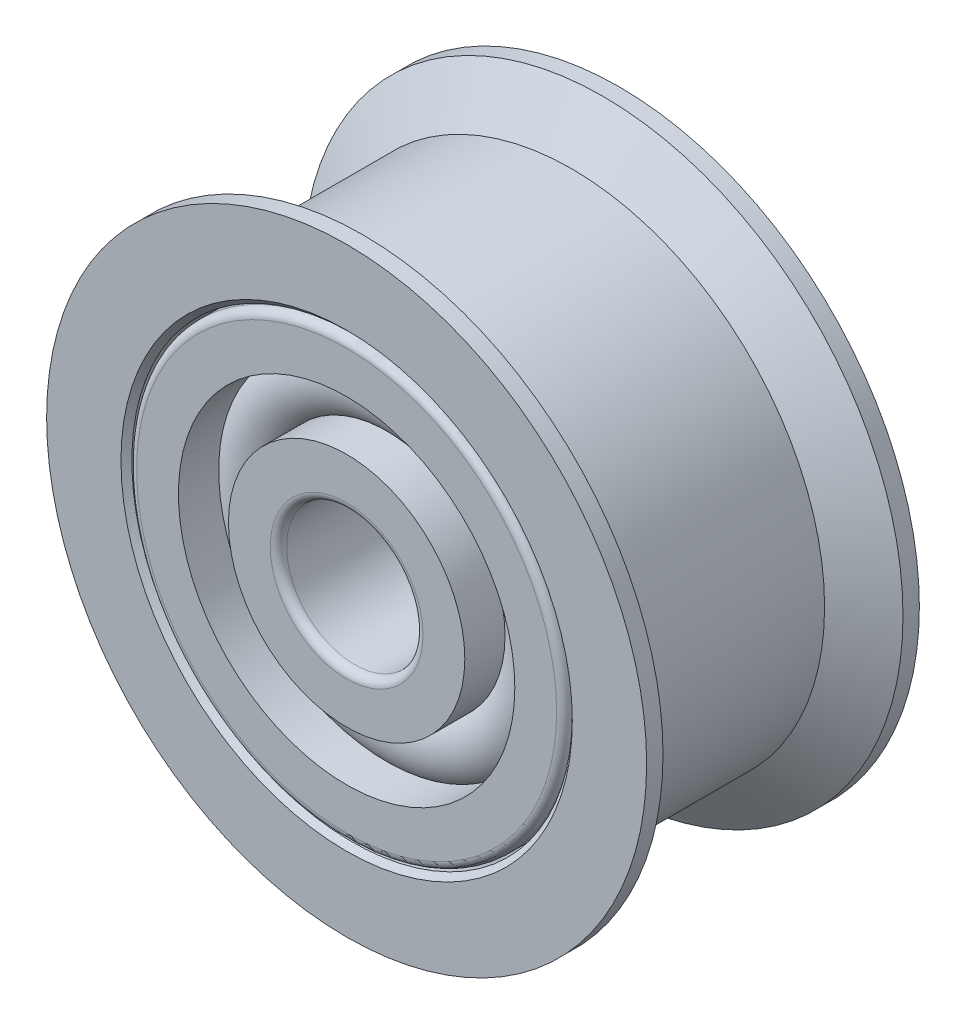
ISO-10303-21;
HEADER;
FILE_DESCRIPTION(('STEP AP214'),'2;1');
FILE_NAME('part.step','',(''),(''),'','','');
FILE_SCHEMA(('AUTOMOTIVE_DESIGN { 1 0 10303 214 1 1 1 1 }'));
ENDSEC;
DATA;
#1=APPLICATION_CONTEXT('core data for automotive mechanical design processes');
#2=APPLICATION_PROTOCOL_DEFINITION('international standard','automotive_design',2000,#1);
#3=PRODUCT_CONTEXT('',#1,'mechanical');
#4=PRODUCT('Part','Part','',(#3));
#5=PRODUCT_RELATED_PRODUCT_CATEGORY('part','',(#4));
#6=PRODUCT_DEFINITION_FORMATION('','',#4);
#7=PRODUCT_DEFINITION_CONTEXT('part definition',#1,'design');
#8=PRODUCT_DEFINITION('design','',#6,#7);
#9=PRODUCT_DEFINITION_SHAPE('','',#8);
#10=(LENGTH_UNIT() NAMED_UNIT(*) SI_UNIT(.MILLI.,.METRE.));
#11=(NAMED_UNIT(*) PLANE_ANGLE_UNIT() SI_UNIT($,.RADIAN.));
#12=(NAMED_UNIT(*) SI_UNIT($,.STERADIAN.) SOLID_ANGLE_UNIT());
#13=UNCERTAINTY_MEASURE_WITH_UNIT(LENGTH_MEASURE(1.E-05),#10,'distance_accuracy_value','');
#14=(GEOMETRIC_REPRESENTATION_CONTEXT(3) GLOBAL_UNCERTAINTY_ASSIGNED_CONTEXT((#13)) GLOBAL_UNIT_ASSIGNED_CONTEXT((#10,
#11,#12)) REPRESENTATION_CONTEXT('',''));
#15=CARTESIAN_POINT('',(0.,0.,0.));
#16=DIRECTION('',(0.,0.,1.));
#17=DIRECTION('',(1.,0.,0.));
#18=AXIS2_PLACEMENT_3D('',#15,#16,#17);
#19=CARTESIAN_POINT('',(0.,8.00000000000001,0.));
#20=DIRECTION('',(0.,0.,1.));
#21=DIRECTION('',(-1.,0.,0.));
#22=AXIS2_PLACEMENT_3D('',#19,#20,#21);
#23=PLANE('',#22);
#24=CARTESIAN_POINT('',(0.,0.,0.));
#25=DIRECTION('',(0.,0.,-1.));
#26=DIRECTION('',(-1.,0.,0.));
#27=AXIS2_PLACEMENT_3D('',#24,#25,#26);
#28=CIRCLE('',#27,7.70000000000001);
#29=CARTESIAN_POINT('',(-7.70000000000001,0.,0.));
#30=VERTEX_POINT('',#29);
#31=EDGE_CURVE('E56',#30,#30,#28,.F.);
#32=ORIENTED_EDGE('',*,*,#31,.F.);
#33=EDGE_LOOP('',(#32));
#34=FACE_BOUND('',#33,.T.);
#35=CARTESIAN_POINT('',(0.,0.,0.));
#36=DIRECTION('',(0.,0.,1.));
#37=DIRECTION('',(1.,0.,0.));
#38=AXIS2_PLACEMENT_3D('',#35,#36,#37);
#39=CIRCLE('',#38,6.16666666666667);
#40=CARTESIAN_POINT('',(6.16666666666667,0.,0.));
#41=VERTEX_POINT('',#40);
#42=EDGE_CURVE('E84',#41,#41,#39,.T.);
#43=ORIENTED_EDGE('',*,*,#42,.T.);
#44=EDGE_LOOP('',(#43));
#45=FACE_BOUND('',#44,.T.);
#46=ADVANCED_FACE('F49',(#34,#45),#23,.F.);
#47=CARTESIAN_POINT('',(0.,0.,-47.8916163431199));
#48=DIRECTION('',(0.,0.,-1.));
#49=DIRECTION('',(1.,0.,0.));
#50=AXIS2_PLACEMENT_3D('',#47,#48,#49);
#51=CYLINDRICAL_SURFACE('',#50,6.16666666666667);
#52=CARTESIAN_POINT('',(0.,0.,1.47513551031261));
#53=DIRECTION('',(0.,0.,-1.));
#54=DIRECTION('',(-1.,0.,0.));
#55=AXIS2_PLACEMENT_3D('',#52,#53,#54);
#56=CIRCLE('',#55,6.16666666666667);
#57=CARTESIAN_POINT('',(-6.16666666666667,0.,1.47513551031261));
#58=VERTEX_POINT('',#57);
#59=EDGE_CURVE('E102',#58,#58,#56,.T.);
#60=ORIENTED_EDGE('',*,*,#59,.F.);
#61=EDGE_LOOP('',(#60));
#62=FACE_BOUND('',#61,.T.);
#63=ORIENTED_EDGE('',*,*,#42,.F.);
#64=EDGE_LOOP('',(#63));
#65=FACE_BOUND('',#64,.T.);
#66=ADVANCED_FACE('F108',(#62,#65),#51,.F.);
#67=CARTESIAN_POINT('',(0.,0.,-47.8916163431199));
#68=DIRECTION('',(0.,0.,-1.));
#69=DIRECTION('',(1.,0.,0.));
#70=AXIS2_PLACEMENT_3D('',#67,#68,#69);
#71=CYLINDRICAL_SURFACE('',#70,6.16666666666667);
#72=CARTESIAN_POINT('',(0.,0.,3.52486448968744));
#73=DIRECTION('',(0.,0.,1.));
#74=DIRECTION('',(1.,0.,0.));
#75=AXIS2_PLACEMENT_3D('',#72,#73,#74);
#76=CIRCLE('',#75,6.16666666666667);
#77=CARTESIAN_POINT('',(6.16666666666667,0.,3.52486448968744));
#78=VERTEX_POINT('',#77);
#79=EDGE_CURVE('E96',#78,#78,#76,.T.);
#80=ORIENTED_EDGE('',*,*,#79,.F.);
#81=EDGE_LOOP('',(#80));
#82=FACE_BOUND('',#81,.T.);
#83=CARTESIAN_POINT('',(0.,0.,5.));
#84=DIRECTION('',(0.,0.,1.));
#85=DIRECTION('',(1.,0.,0.));
#86=AXIS2_PLACEMENT_3D('',#83,#84,#85);
#87=CIRCLE('',#86,6.16666666666667);
#88=CARTESIAN_POINT('',(6.16666666666667,0.,5.));
#89=VERTEX_POINT('',#88);
#90=EDGE_CURVE('E87',#89,#89,#87,.T.);
#91=ORIENTED_EDGE('',*,*,#90,.T.);
#92=EDGE_LOOP('',(#91));
#93=FACE_BOUND('',#92,.T.);
#94=ADVANCED_FACE('F111',(#82,#93),#71,.F.);
#95=CARTESIAN_POINT('',(0.,8.00000000000001,4.99999999999999));
#96=DIRECTION('',(0.,0.,-1.));
#97=DIRECTION('',(1.,0.,0.));
#98=AXIS2_PLACEMENT_3D('',#95,#96,#97);
#99=PLANE('',#98);
#100=CARTESIAN_POINT('',(0.,0.,4.99999999999999));
#101=DIRECTION('',(0.,0.,1.));
#102=DIRECTION('',(1.,0.,0.));
#103=AXIS2_PLACEMENT_3D('',#100,#101,#102);
#104=CIRCLE('',#103,7.70000000000001);
#105=CARTESIAN_POINT('',(7.70000000000001,0.,4.99999999999999));
#106=VERTEX_POINT('',#105);
#107=EDGE_CURVE('E60',#106,#106,#104,.F.);
#108=ORIENTED_EDGE('',*,*,#107,.F.);
#109=EDGE_LOOP('',(#108));
#110=FACE_BOUND('',#109,.T.);
#111=ORIENTED_EDGE('',*,*,#90,.F.);
#112=EDGE_LOOP('',(#111));
#113=FACE_BOUND('',#112,.T.);
#114=ADVANCED_FACE('F142',(#110,#113),#99,.F.);
#115=CARTESIAN_POINT('',(0.,0.,-47.8916163431199));
#116=DIRECTION('',(0.,0.,-1.));
#117=DIRECTION('',(1.,0.,0.));
#118=AXIS2_PLACEMENT_3D('',#115,#116,#117);
#119=CYLINDRICAL_SURFACE('',#118,8.00000000000001);
#120=CARTESIAN_POINT('',(0.,0.,4.7));
#121=DIRECTION('',(0.,0.,1.));
#122=DIRECTION('',(1.,0.,0.));
#123=AXIS2_PLACEMENT_3D('',#120,#121,#122);
#124=CIRCLE('',#123,8.00000000000001);
#125=CARTESIAN_POINT('',(8.00000000000001,0.,4.7));
#126=VERTEX_POINT('',#125);
#127=EDGE_CURVE('E64',#126,#126,#124,.T.);
#128=ORIENTED_EDGE('',*,*,#127,.F.);
#129=EDGE_LOOP('',(#128));
#130=FACE_BOUND('',#129,.T.);
#131=CARTESIAN_POINT('',(0.,0.,0.300000000000022));
#132=DIRECTION('',(0.,0.,-1.));
#133=DIRECTION('',(-1.,0.,0.));
#134=AXIS2_PLACEMENT_3D('',#131,#132,#133);
#135=CIRCLE('',#134,8.00000000000001);
#136=CARTESIAN_POINT('',(-8.00000000000001,0.,0.300000000000022));
#137=VERTEX_POINT('',#136);
#138=EDGE_CURVE('E69',#137,#137,#135,.T.);
#139=ORIENTED_EDGE('',*,*,#138,.F.);
#140=EDGE_LOOP('',(#139));
#141=FACE_BOUND('',#140,.T.);
#142=ADVANCED_FACE('F135',(#130,#141),#119,.T.);
#143=CARTESIAN_POINT('',(0.,0.,4.7));
#144=DIRECTION('',(0.,0.,-1.));
#145=DIRECTION('',(1.,0.,0.));
#146=AXIS2_PLACEMENT_3D('',#143,#144,#145);
#147=TOROIDAL_SURFACE('',#146,7.70000000000001,0.3);
#148=ORIENTED_EDGE('',*,*,#107,.T.);
#149=EDGE_LOOP('',(#148));
#150=FACE_BOUND('',#149,.T.);
#151=ORIENTED_EDGE('',*,*,#127,.T.);
#152=EDGE_LOOP('',(#151));
#153=FACE_BOUND('',#152,.T.);
#154=ADVANCED_FACE('F133',(#150,#153),#147,.T.);
#155=CARTESIAN_POINT('',(0.,0.,0.300000000000022));
#156=DIRECTION('',(0.,0.,1.));
#157=DIRECTION('',(-1.,0.,0.));
#158=AXIS2_PLACEMENT_3D('',#155,#156,#157);
#159=TOROIDAL_SURFACE('',#158,7.70000000000001,0.3);
#160=ORIENTED_EDGE('',*,*,#138,.T.);
#161=EDGE_LOOP('',(#160));
#162=FACE_BOUND('',#161,.T.);
#163=ORIENTED_EDGE('',*,*,#31,.T.);
#164=EDGE_LOOP('',(#163));
#165=FACE_BOUND('',#164,.T.);
#166=ADVANCED_FACE('F51',(#162,#165),#159,.T.);
#167=CARTESIAN_POINT('',(0.,0.,2.50000000000002));
#168=DIRECTION('',(0.,0.,1.));
#169=DIRECTION('',(-1.,0.,0.));
#170=AXIS2_PLACEMENT_3D('',#167,#168,#169);
#171=TOROIDAL_SURFACE('',#170,5.25000000000001,1.375);
#172=ORIENTED_EDGE('',*,*,#59,.T.);
#173=EDGE_LOOP('',(#172));
#174=FACE_BOUND('',#173,.T.);
#175=CARTESIAN_POINT('',(0.,0.,1.47513551031263));
#176=DIRECTION('',(0.,0.,-1.));
#177=DIRECTION('',(-1.,0.,0.));
#178=AXIS2_PLACEMENT_3D('',#175,#176,#177);
#179=CIRCLE('',#178,4.33333333333333);
#180=CARTESIAN_POINT('',(-4.33333333333333,0.,1.47513551031263));
#181=VERTEX_POINT('',#180);
#182=EDGE_CURVE('E11',#181,#181,#179,.F.);
#183=ORIENTED_EDGE('',*,*,#182,.T.);
#184=EDGE_LOOP('',(#183));
#185=FACE_BOUND('',#184,.T.);
#186=ADVANCED_FACE('F106',(#174,#185),#171,.T.);
#187=CARTESIAN_POINT('',(0.,0.,3.52486448968741));
#188=DIRECTION('',(0.,0.,1.));
#189=DIRECTION('',(1.,0.,0.));
#190=AXIS2_PLACEMENT_3D('',#187,#188,#189);
#191=CIRCLE('',#190,4.33333333333333);
#192=CARTESIAN_POINT('',(4.33333333333333,0.,3.52486448968741));
#193=VERTEX_POINT('',#192);
#194=EDGE_CURVE('E99',#193,#193,#191,.F.);
#195=ORIENTED_EDGE('',*,*,#194,.T.);
#196=EDGE_LOOP('',(#195));
#197=FACE_BOUND('',#196,.T.);
#198=ORIENTED_EDGE('',*,*,#79,.T.);
#199=EDGE_LOOP('',(#198));
#200=FACE_BOUND('',#199,.T.);
#201=ADVANCED_FACE('F126',(#197,#200),#171,.T.);
#202=CARTESIAN_POINT('',(0.,0.,4.7));
#203=DIRECTION('',(0.,0.,-1.));
#204=DIRECTION('',(1.,0.,0.));
#205=AXIS2_PLACEMENT_3D('',#202,#203,#204);
#206=TOROIDAL_SURFACE('',#205,2.8,0.3);
#207=CARTESIAN_POINT('',(0.,0.,4.7));
#208=DIRECTION('',(0.,0.,1.));
#209=DIRECTION('',(1.,0.,0.));
#210=AXIS2_PLACEMENT_3D('',#207,#208,#209);
#211=CIRCLE('',#210,2.5);
#212=CARTESIAN_POINT('',(2.5,0.,4.7));
#213=VERTEX_POINT('',#212);
#214=EDGE_CURVE('E75',#213,#213,#211,.F.);
#215=ORIENTED_EDGE('',*,*,#214,.T.);
#216=EDGE_LOOP('',(#215));
#217=FACE_BOUND('',#216,.T.);
#218=CARTESIAN_POINT('',(0.,0.,5.00000000000001));
#219=DIRECTION('',(0.,0.,1.));
#220=DIRECTION('',(1.,0.,0.));
#221=AXIS2_PLACEMENT_3D('',#218,#219,#220);
#222=CIRCLE('',#221,2.8);
#223=CARTESIAN_POINT('',(2.8,0.,5.00000000000001));
#224=VERTEX_POINT('',#223);
#225=EDGE_CURVE('E81',#224,#224,#222,.T.);
#226=ORIENTED_EDGE('',*,*,#225,.T.);
#227=EDGE_LOOP('',(#226));
#228=FACE_BOUND('',#227,.T.);
#229=ADVANCED_FACE('F122',(#217,#228),#206,.T.);
#230=CARTESIAN_POINT('',(0.,2.5,5.00000000000001));
#231=DIRECTION('',(0.,0.,-1.));
#232=DIRECTION('',(1.,0.,0.));
#233=AXIS2_PLACEMENT_3D('',#230,#231,#232);
#234=PLANE('',#233);
#235=ORIENTED_EDGE('',*,*,#225,.F.);
#236=EDGE_LOOP('',(#235));
#237=FACE_BOUND('',#236,.T.);
#238=CARTESIAN_POINT('',(0.,0.,5.00000000000001));
#239=DIRECTION('',(0.,0.,1.));
#240=DIRECTION('',(1.,0.,0.));
#241=AXIS2_PLACEMENT_3D('',#238,#239,#240);
#242=CIRCLE('',#241,4.33333333333333);
#243=CARTESIAN_POINT('',(4.33333333333333,0.,5.00000000000001));
#244=VERTEX_POINT('',#243);
#245=EDGE_CURVE('E90',#244,#244,#242,.T.);
#246=ORIENTED_EDGE('',*,*,#245,.T.);
#247=EDGE_LOOP('',(#246));
#248=FACE_BOUND('',#247,.T.);
#249=ADVANCED_FACE('F125',(#237,#248),#234,.F.);
#250=CARTESIAN_POINT('',(0.,0.,-68.3625909056195));
#251=DIRECTION('',(0.,0.,-1.));
#252=DIRECTION('',(1.,0.,0.));
#253=AXIS2_PLACEMENT_3D('',#250,#251,#252);
#254=CYLINDRICAL_SURFACE('',#253,4.33333333333333);
#255=ORIENTED_EDGE('',*,*,#194,.F.);
#256=EDGE_LOOP('',(#255));
#257=FACE_BOUND('',#256,.T.);
#258=ORIENTED_EDGE('',*,*,#245,.F.);
#259=EDGE_LOOP('',(#258));
#260=FACE_BOUND('',#259,.T.);
#261=ADVANCED_FACE('F168',(#257,#260),#254,.T.);
#262=CARTESIAN_POINT('',(0.,0.,-68.3625909056195));
#263=DIRECTION('',(0.,0.,-1.));
#264=DIRECTION('',(1.,0.,0.));
#265=AXIS2_PLACEMENT_3D('',#262,#263,#264);
#266=CYLINDRICAL_SURFACE('',#265,2.5);
#267=ORIENTED_EDGE('',*,*,#214,.F.);
#268=EDGE_LOOP('',(#267));
#269=FACE_BOUND('',#268,.T.);
#270=CARTESIAN_POINT('',(0.,0.,0.300000000000029));
#271=DIRECTION('',(0.,0.,-1.));
#272=DIRECTION('',(-1.,0.,0.));
#273=AXIS2_PLACEMENT_3D('',#270,#271,#272);
#274=CIRCLE('',#273,2.5);
#275=CARTESIAN_POINT('',(-2.5,0.,0.300000000000029));
#276=VERTEX_POINT('',#275);
#277=EDGE_CURVE('E78',#276,#276,#274,.F.);
#278=ORIENTED_EDGE('',*,*,#277,.F.);
#279=EDGE_LOOP('',(#278));
#280=FACE_BOUND('',#279,.T.);
#281=ADVANCED_FACE('F131',(#269,#280),#266,.F.);
#282=CARTESIAN_POINT('',(0.,0.,0.300000000000029));
#283=DIRECTION('',(0.,0.,1.));
#284=DIRECTION('',(-1.,0.,0.));
#285=AXIS2_PLACEMENT_3D('',#282,#283,#284);
#286=TOROIDAL_SURFACE('',#285,2.8,0.3);
#287=CARTESIAN_POINT('',(0.,0.,0.));
#288=DIRECTION('',(0.,0.,-1.));
#289=DIRECTION('',(-1.,0.,0.));
#290=AXIS2_PLACEMENT_3D('',#287,#288,#289);
#291=CIRCLE('',#290,2.8);
#292=CARTESIAN_POINT('',(-2.8,0.,0.));
#293=VERTEX_POINT('',#292);
#294=EDGE_CURVE('E72',#293,#293,#291,.T.);
#295=ORIENTED_EDGE('',*,*,#294,.T.);
#296=EDGE_LOOP('',(#295));
#297=FACE_BOUND('',#296,.T.);
#298=ORIENTED_EDGE('',*,*,#277,.T.);
#299=EDGE_LOOP('',(#298));
#300=FACE_BOUND('',#299,.T.);
#301=ADVANCED_FACE('F128',(#297,#300),#286,.T.);
#302=CARTESIAN_POINT('',(0.,2.5,0.));
#303=DIRECTION('',(0.,0.,1.));
#304=DIRECTION('',(-1.,0.,0.));
#305=AXIS2_PLACEMENT_3D('',#302,#303,#304);
#306=PLANE('',#305);
#307=ORIENTED_EDGE('',*,*,#294,.F.);
#308=EDGE_LOOP('',(#307));
#309=FACE_BOUND('',#308,.T.);
#310=CARTESIAN_POINT('',(0.,0.,0.));
#311=DIRECTION('',(0.,0.,1.));
#312=DIRECTION('',(1.,0.,0.));
#313=AXIS2_PLACEMENT_3D('',#310,#311,#312);
#314=CIRCLE('',#313,4.33333333333333);
#315=CARTESIAN_POINT('',(4.33333333333333,0.,0.));
#316=VERTEX_POINT('',#315);
#317=EDGE_CURVE('E93',#316,#316,#314,.T.);
#318=ORIENTED_EDGE('',*,*,#317,.F.);
#319=EDGE_LOOP('',(#318));
#320=FACE_BOUND('',#319,.T.);
#321=ADVANCED_FACE('F130',(#309,#320),#306,.F.);
#322=CARTESIAN_POINT('',(0.,0.,-68.3625909056195));
#323=DIRECTION('',(0.,0.,-1.));
#324=DIRECTION('',(1.,0.,0.));
#325=AXIS2_PLACEMENT_3D('',#322,#323,#324);
#326=CYLINDRICAL_SURFACE('',#325,4.33333333333333);
#327=ORIENTED_EDGE('',*,*,#182,.F.);
#328=EDGE_LOOP('',(#327));
#329=FACE_BOUND('',#328,.T.);
#330=ORIENTED_EDGE('',*,*,#317,.T.);
#331=EDGE_LOOP('',(#330));
#332=FACE_BOUND('',#331,.T.);
#333=ADVANCED_FACE('F164',(#329,#332),#326,.T.);
#334=CLOSED_SHELL('',(#46,#66,#94,#114,#142,#154,#166,#186,#201,#229,#249,#261,#281,#301,#321,#333));
#335=MANIFOLD_SOLID_BREP('B2',#334);
#336=CARTESIAN_POINT('',(0.,8.00000000000001,0.));
#337=DIRECTION('',(0.,0.,-1.));
#338=DIRECTION('',(-1.,0.,0.));
#339=AXIS2_PLACEMENT_3D('',#336,#337,#338);
#340=PLANE('',#339);
#341=CARTESIAN_POINT('',(0.,0.,0.));
#342=DIRECTION('',(0.,0.,-1.));
#343=DIRECTION('',(-1.,0.,0.));
#344=AXIS2_PLACEMENT_3D('',#341,#342,#343);
#345=CIRCLE('',#344,7.70000000000001);
#346=CARTESIAN_POINT('',(-7.70000000000001,0.,0.));
#347=VERTEX_POINT('',#346);
#348=EDGE_CURVE('E304',#347,#347,#345,.F.);
#349=ORIENTED_EDGE('',*,*,#348,.T.);
#350=EDGE_LOOP('',(#349));
#351=FACE_BOUND('',#350,.T.);
#352=CARTESIAN_POINT('',(0.,0.,0.));
#353=DIRECTION('',(0.,0.,1.));
#354=DIRECTION('',(1.,0.,0.));
#355=AXIS2_PLACEMENT_3D('',#352,#353,#354);
#356=CIRCLE('',#355,6.16666666666667);
#357=CARTESIAN_POINT('',(6.16666666666667,0.,0.));
#358=VERTEX_POINT('',#357);
#359=EDGE_CURVE('E332',#358,#358,#356,.T.);
#360=ORIENTED_EDGE('',*,*,#359,.F.);
#361=EDGE_LOOP('',(#360));
#362=FACE_BOUND('',#361,.T.);
#363=ADVANCED_FACE('F297',(#351,#362),#340,.F.);
#364=CARTESIAN_POINT('',(0.,0.,47.8916163431199));
#365=DIRECTION('',(0.,0.,1.));
#366=DIRECTION('',(1.,0.,0.));
#367=AXIS2_PLACEMENT_3D('',#364,#365,#366);
#368=CYLINDRICAL_SURFACE('',#367,6.16666666666667);
#369=CARTESIAN_POINT('',(0.,0.,-1.47513551031261));
#370=DIRECTION('',(0.,0.,-1.));
#371=DIRECTION('',(-1.,0.,0.));
#372=AXIS2_PLACEMENT_3D('',#369,#370,#371);
#373=CIRCLE('',#372,6.16666666666667);
#374=CARTESIAN_POINT('',(-6.16666666666667,0.,-1.47513551031261));
#375=VERTEX_POINT('',#374);
#376=EDGE_CURVE('E350',#375,#375,#373,.T.);
#377=ORIENTED_EDGE('',*,*,#376,.T.);
#378=EDGE_LOOP('',(#377));
#379=FACE_BOUND('',#378,.T.);
#380=ORIENTED_EDGE('',*,*,#359,.T.);
#381=EDGE_LOOP('',(#380));
#382=FACE_BOUND('',#381,.T.);
#383=ADVANCED_FACE('F354',(#379,#382),#368,.F.);
#384=CARTESIAN_POINT('',(0.,0.,47.8916163431199));
#385=DIRECTION('',(0.,0.,1.));
#386=DIRECTION('',(1.,0.,0.));
#387=AXIS2_PLACEMENT_3D('',#384,#385,#386);
#388=CYLINDRICAL_SURFACE('',#387,6.16666666666667);
#389=CARTESIAN_POINT('',(0.,0.,-3.52486448968744));
#390=DIRECTION('',(0.,0.,1.));
#391=DIRECTION('',(1.,0.,0.));
#392=AXIS2_PLACEMENT_3D('',#389,#390,#391);
#393=CIRCLE('',#392,6.16666666666667);
#394=CARTESIAN_POINT('',(6.16666666666667,0.,-3.52486448968744));
#395=VERTEX_POINT('',#394);
#396=EDGE_CURVE('E344',#395,#395,#393,.T.);
#397=ORIENTED_EDGE('',*,*,#396,.T.);
#398=EDGE_LOOP('',(#397));
#399=FACE_BOUND('',#398,.T.);
#400=CARTESIAN_POINT('',(0.,0.,-5.));
#401=DIRECTION('',(0.,0.,1.));
#402=DIRECTION('',(1.,0.,0.));
#403=AXIS2_PLACEMENT_3D('',#400,#401,#402);
#404=CIRCLE('',#403,6.16666666666667);
#405=CARTESIAN_POINT('',(6.16666666666667,0.,-5.));
#406=VERTEX_POINT('',#405);
#407=EDGE_CURVE('E335',#406,#406,#404,.T.);
#408=ORIENTED_EDGE('',*,*,#407,.F.);
#409=EDGE_LOOP('',(#408));
#410=FACE_BOUND('',#409,.T.);
#411=ADVANCED_FACE('F376',(#399,#410),#388,.F.);
#412=CARTESIAN_POINT('',(0.,8.00000000000001,-4.99999999999999));
#413=DIRECTION('',(0.,0.,1.));
#414=DIRECTION('',(1.,0.,0.));
#415=AXIS2_PLACEMENT_3D('',#412,#413,#414);
#416=PLANE('',#415);
#417=CARTESIAN_POINT('',(0.,0.,-4.99999999999999));
#418=DIRECTION('',(0.,0.,1.));
#419=DIRECTION('',(1.,0.,0.));
#420=AXIS2_PLACEMENT_3D('',#417,#418,#419);
#421=CIRCLE('',#420,7.70000000000001);
#422=CARTESIAN_POINT('',(7.70000000000001,0.,-4.99999999999999));
#423=VERTEX_POINT('',#422);
#424=EDGE_CURVE('E308',#423,#423,#421,.F.);
#425=ORIENTED_EDGE('',*,*,#424,.T.);
#426=EDGE_LOOP('',(#425));
#427=FACE_BOUND('',#426,.T.);
#428=ORIENTED_EDGE('',*,*,#407,.T.);
#429=EDGE_LOOP('',(#428));
#430=FACE_BOUND('',#429,.T.);
#431=ADVANCED_FACE('F396',(#427,#430),#416,.F.);
#432=CARTESIAN_POINT('',(0.,0.,47.8916163431199));
#433=DIRECTION('',(0.,0.,1.));
#434=DIRECTION('',(1.,0.,0.));
#435=AXIS2_PLACEMENT_3D('',#432,#433,#434);
#436=CYLINDRICAL_SURFACE('',#435,8.00000000000001);
#437=CARTESIAN_POINT('',(0.,0.,-4.7));
#438=DIRECTION('',(0.,0.,1.));
#439=DIRECTION('',(1.,0.,0.));
#440=AXIS2_PLACEMENT_3D('',#437,#438,#439);
#441=CIRCLE('',#440,8.00000000000001);
#442=CARTESIAN_POINT('',(8.00000000000001,0.,-4.7));
#443=VERTEX_POINT('',#442);
#444=EDGE_CURVE('E312',#443,#443,#441,.T.);
#445=ORIENTED_EDGE('',*,*,#444,.T.);
#446=EDGE_LOOP('',(#445));
#447=FACE_BOUND('',#446,.T.);
#448=CARTESIAN_POINT('',(0.,0.,-0.300000000000022));
#449=DIRECTION('',(0.,0.,-1.));
#450=DIRECTION('',(-1.,0.,0.));
#451=AXIS2_PLACEMENT_3D('',#448,#449,#450);
#452=CIRCLE('',#451,8.00000000000001);
#453=CARTESIAN_POINT('',(-8.00000000000001,0.,-0.300000000000022));
#454=VERTEX_POINT('',#453);
#455=EDGE_CURVE('E317',#454,#454,#452,.T.);
#456=ORIENTED_EDGE('',*,*,#455,.T.);
#457=EDGE_LOOP('',(#456));
#458=FACE_BOUND('',#457,.T.);
#459=ADVANCED_FACE('F391',(#447,#458),#436,.T.);
#460=CARTESIAN_POINT('',(0.,0.,-4.7));
#461=DIRECTION('',(0.,0.,1.));
#462=DIRECTION('',(1.,0.,0.));
#463=AXIS2_PLACEMENT_3D('',#460,#461,#462);
#464=TOROIDAL_SURFACE('',#463,7.70000000000001,0.3);
#465=ORIENTED_EDGE('',*,*,#424,.F.);
#466=EDGE_LOOP('',(#465));
#467=FACE_BOUND('',#466,.T.);
#468=ORIENTED_EDGE('',*,*,#444,.F.);
#469=EDGE_LOOP('',(#468));
#470=FACE_BOUND('',#469,.T.);
#471=ADVANCED_FACE('F368',(#467,#470),#464,.T.);
#472=CARTESIAN_POINT('',(0.,0.,-0.300000000000022));
#473=DIRECTION('',(0.,0.,-1.));
#474=DIRECTION('',(-1.,0.,0.));
#475=AXIS2_PLACEMENT_3D('',#472,#473,#474);
#476=TOROIDAL_SURFACE('',#475,7.70000000000001,0.3);
#477=ORIENTED_EDGE('',*,*,#455,.F.);
#478=EDGE_LOOP('',(#477));
#479=FACE_BOUND('',#478,.T.);
#480=ORIENTED_EDGE('',*,*,#348,.F.);
#481=EDGE_LOOP('',(#480));
#482=FACE_BOUND('',#481,.T.);
#483=ADVANCED_FACE('F299',(#479,#482),#476,.T.);
#484=CARTESIAN_POINT('',(0.,0.,-2.50000000000002));
#485=DIRECTION('',(0.,0.,-1.));
#486=DIRECTION('',(-1.,0.,0.));
#487=AXIS2_PLACEMENT_3D('',#484,#485,#486);
#488=TOROIDAL_SURFACE('',#487,5.25000000000001,1.375);
#489=ORIENTED_EDGE('',*,*,#376,.F.);
#490=EDGE_LOOP('',(#489));
#491=FACE_BOUND('',#490,.T.);
#492=CARTESIAN_POINT('',(0.,0.,-1.47513551031263));
#493=DIRECTION('',(0.,0.,-1.));
#494=DIRECTION('',(-1.,0.,0.));
#495=AXIS2_PLACEMENT_3D('',#492,#493,#494);
#496=CIRCLE('',#495,4.33333333333333);
#497=CARTESIAN_POINT('',(-4.33333333333333,0.,-1.47513551031263));
#498=VERTEX_POINT('',#497);
#499=EDGE_CURVE('E48',#498,#498,#496,.F.);
#500=ORIENTED_EDGE('',*,*,#499,.F.);
#501=EDGE_LOOP('',(#500));
#502=FACE_BOUND('',#501,.T.);
#503=ADVANCED_FACE('F357',(#491,#502),#488,.T.);
#504=CARTESIAN_POINT('',(0.,0.,-3.52486448968741));
#505=DIRECTION('',(0.,0.,1.));
#506=DIRECTION('',(1.,0.,0.));
#507=AXIS2_PLACEMENT_3D('',#504,#505,#506);
#508=CIRCLE('',#507,4.33333333333333);
#509=CARTESIAN_POINT('',(4.33333333333333,0.,-3.52486448968741));
#510=VERTEX_POINT('',#509);
#511=EDGE_CURVE('E347',#510,#510,#508,.F.);
#512=ORIENTED_EDGE('',*,*,#511,.F.);
#513=EDGE_LOOP('',(#512));
#514=FACE_BOUND('',#513,.T.);
#515=ORIENTED_EDGE('',*,*,#396,.F.);
#516=EDGE_LOOP('',(#515));
#517=FACE_BOUND('',#516,.T.);
#518=ADVANCED_FACE('F360',(#514,#517),#488,.T.);
#519=CARTESIAN_POINT('',(0.,0.,-4.7));
#520=DIRECTION('',(0.,0.,1.));
#521=DIRECTION('',(1.,0.,0.));
#522=AXIS2_PLACEMENT_3D('',#519,#520,#521);
#523=TOROIDAL_SURFACE('',#522,2.8,0.3);
#524=CARTESIAN_POINT('',(0.,0.,-4.7));
#525=DIRECTION('',(0.,0.,1.));
#526=DIRECTION('',(1.,0.,0.));
#527=AXIS2_PLACEMENT_3D('',#524,#525,#526);
#528=CIRCLE('',#527,2.5);
#529=CARTESIAN_POINT('',(2.5,0.,-4.7));
#530=VERTEX_POINT('',#529);
#531=EDGE_CURVE('E323',#530,#530,#528,.F.);
#532=ORIENTED_EDGE('',*,*,#531,.F.);
#533=EDGE_LOOP('',(#532));
#534=FACE_BOUND('',#533,.T.);
#535=CARTESIAN_POINT('',(0.,0.,-5.00000000000001));
#536=DIRECTION('',(0.,0.,1.));
#537=DIRECTION('',(1.,0.,0.));
#538=AXIS2_PLACEMENT_3D('',#535,#536,#537);
#539=CIRCLE('',#538,2.8);
#540=CARTESIAN_POINT('',(2.8,0.,-5.00000000000001));
#541=VERTEX_POINT('',#540);
#542=EDGE_CURVE('E329',#541,#541,#539,.T.);
#543=ORIENTED_EDGE('',*,*,#542,.F.);
#544=EDGE_LOOP('',(#543));
#545=FACE_BOUND('',#544,.T.);
#546=ADVANCED_FACE('F366',(#534,#545),#523,.T.);
#547=CARTESIAN_POINT('',(0.,2.5,-5.00000000000001));
#548=DIRECTION('',(0.,0.,1.));
#549=DIRECTION('',(1.,0.,0.));
#550=AXIS2_PLACEMENT_3D('',#547,#548,#549);
#551=PLANE('',#550);
#552=ORIENTED_EDGE('',*,*,#542,.T.);
#553=EDGE_LOOP('',(#552));
#554=FACE_BOUND('',#553,.T.);
#555=CARTESIAN_POINT('',(0.,0.,-5.00000000000001));
#556=DIRECTION('',(0.,0.,1.));
#557=DIRECTION('',(1.,0.,0.));
#558=AXIS2_PLACEMENT_3D('',#555,#556,#557);
#559=CIRCLE('',#558,4.33333333333333);
#560=CARTESIAN_POINT('',(4.33333333333333,0.,-5.00000000000001));
#561=VERTEX_POINT('',#560);
#562=EDGE_CURVE('E338',#561,#561,#559,.T.);
#563=ORIENTED_EDGE('',*,*,#562,.F.);
#564=EDGE_LOOP('',(#563));
#565=FACE_BOUND('',#564,.T.);
#566=ADVANCED_FACE('F383',(#554,#565),#551,.F.);
#567=CARTESIAN_POINT('',(0.,0.,68.3625909056195));
#568=DIRECTION('',(0.,0.,1.));
#569=DIRECTION('',(1.,0.,0.));
#570=AXIS2_PLACEMENT_3D('',#567,#568,#569);
#571=CYLINDRICAL_SURFACE('',#570,4.33333333333333);
#572=ORIENTED_EDGE('',*,*,#511,.T.);
#573=EDGE_LOOP('',(#572));
#574=FACE_BOUND('',#573,.T.);
#575=ORIENTED_EDGE('',*,*,#562,.T.);
#576=EDGE_LOOP('',(#575));
#577=FACE_BOUND('',#576,.T.);
#578=ADVANCED_FACE('F422',(#574,#577),#571,.T.);
#579=CARTESIAN_POINT('',(0.,0.,68.3625909056195));
#580=DIRECTION('',(0.,0.,1.));
#581=DIRECTION('',(1.,0.,0.));
#582=AXIS2_PLACEMENT_3D('',#579,#580,#581);
#583=CYLINDRICAL_SURFACE('',#582,2.5);
#584=ORIENTED_EDGE('',*,*,#531,.T.);
#585=EDGE_LOOP('',(#584));
#586=FACE_BOUND('',#585,.T.);
#587=CARTESIAN_POINT('',(0.,0.,-0.300000000000029));
#588=DIRECTION('',(0.,0.,-1.));
#589=DIRECTION('',(-1.,0.,0.));
#590=AXIS2_PLACEMENT_3D('',#587,#588,#589);
#591=CIRCLE('',#590,2.5);
#592=CARTESIAN_POINT('',(-2.5,0.,-0.300000000000029));
#593=VERTEX_POINT('',#592);
#594=EDGE_CURVE('E326',#593,#593,#591,.F.);
#595=ORIENTED_EDGE('',*,*,#594,.T.);
#596=EDGE_LOOP('',(#595));
#597=FACE_BOUND('',#596,.T.);
#598=ADVANCED_FACE('F388',(#586,#597),#583,.F.);
#599=CARTESIAN_POINT('',(0.,0.,-0.300000000000029));
#600=DIRECTION('',(0.,0.,-1.));
#601=DIRECTION('',(-1.,0.,0.));
#602=AXIS2_PLACEMENT_3D('',#599,#600,#601);
#603=TOROIDAL_SURFACE('',#602,2.8,0.3);
#604=CARTESIAN_POINT('',(0.,0.,0.));
#605=DIRECTION('',(0.,0.,-1.));
#606=DIRECTION('',(-1.,0.,0.));
#607=AXIS2_PLACEMENT_3D('',#604,#605,#606);
#608=CIRCLE('',#607,2.8);
#609=CARTESIAN_POINT('',(-2.8,0.,0.));
#610=VERTEX_POINT('',#609);
#611=EDGE_CURVE('E320',#610,#610,#608,.T.);
#612=ORIENTED_EDGE('',*,*,#611,.F.);
#613=EDGE_LOOP('',(#612));
#614=FACE_BOUND('',#613,.T.);
#615=ORIENTED_EDGE('',*,*,#594,.F.);
#616=EDGE_LOOP('',(#615));
#617=FACE_BOUND('',#616,.T.);
#618=ADVANCED_FACE('F385',(#614,#617),#603,.T.);
#619=CARTESIAN_POINT('',(0.,2.5,0.));
#620=DIRECTION('',(0.,0.,-1.));
#621=DIRECTION('',(-1.,0.,0.));
#622=AXIS2_PLACEMENT_3D('',#619,#620,#621);
#623=PLANE('',#622);
#624=ORIENTED_EDGE('',*,*,#611,.T.);
#625=EDGE_LOOP('',(#624));
#626=FACE_BOUND('',#625,.T.);
#627=CARTESIAN_POINT('',(0.,0.,0.));
#628=DIRECTION('',(0.,0.,1.));
#629=DIRECTION('',(1.,0.,0.));
#630=AXIS2_PLACEMENT_3D('',#627,#628,#629);
#631=CIRCLE('',#630,4.33333333333333);
#632=CARTESIAN_POINT('',(4.33333333333333,0.,0.));
#633=VERTEX_POINT('',#632);
#634=EDGE_CURVE('E341',#633,#633,#631,.T.);
#635=ORIENTED_EDGE('',*,*,#634,.T.);
#636=EDGE_LOOP('',(#635));
#637=FACE_BOUND('',#636,.T.);
#638=ADVANCED_FACE('F387',(#626,#637),#623,.F.);
#639=CARTESIAN_POINT('',(0.,0.,68.3625909056195));
#640=DIRECTION('',(0.,0.,1.));
#641=DIRECTION('',(1.,0.,0.));
#642=AXIS2_PLACEMENT_3D('',#639,#640,#641);
#643=CYLINDRICAL_SURFACE('',#642,4.33333333333333);
#644=ORIENTED_EDGE('',*,*,#499,.T.);
#645=EDGE_LOOP('',(#644));
#646=FACE_BOUND('',#645,.T.);
#647=ORIENTED_EDGE('',*,*,#634,.F.);
#648=EDGE_LOOP('',(#647));
#649=FACE_BOUND('',#648,.T.);
#650=ADVANCED_FACE('F418',(#646,#649),#643,.T.);
#651=CLOSED_SHELL('',(#363,#383,#411,#431,#459,#471,#483,#503,#518,#546,#566,#578,#598,#618,
#638,#650));
#652=MANIFOLD_SOLID_BREP('B6',#651);
#653=CARTESIAN_POINT('',(0.,0.,5.));
#654=DIRECTION('',(0.,0.,1.));
#655=DIRECTION('',(1.,0.,0.));
#656=AXIS2_PLACEMENT_3D('',#653,#654,#655);
#657=CYLINDRICAL_SURFACE('',#656,11.);
#658=CARTESIAN_POINT('',(0.,0.,-5.));
#659=DIRECTION('',(0.,0.,1.));
#660=DIRECTION('',(1.,0.,0.));
#661=AXIS2_PLACEMENT_3D('',#658,#659,#660);
#662=CIRCLE('',#661,11.);
#663=CARTESIAN_POINT('',(11.,0.,-5.));
#664=VERTEX_POINT('',#663);
#665=EDGE_CURVE('E581',#664,#664,#662,.T.);
#666=ORIENTED_EDGE('',*,*,#665,.T.);
#667=EDGE_LOOP('',(#666));
#668=FACE_BOUND('',#667,.T.);
#669=CARTESIAN_POINT('',(0.,0.,-4.4));
#670=DIRECTION('',(0.,0.,1.));
#671=DIRECTION('',(1.,0.,0.));
#672=AXIS2_PLACEMENT_3D('',#669,#670,#671);
#673=CIRCLE('',#672,11.);
#674=CARTESIAN_POINT('',(11.,0.,-4.4));
#675=VERTEX_POINT('',#674);
#676=EDGE_CURVE('E561',#675,#675,#673,.T.);
#677=ORIENTED_EDGE('',*,*,#676,.F.);
#678=EDGE_LOOP('',(#677));
#679=FACE_BOUND('',#678,.T.);
#680=ADVANCED_FACE('F537',(#668,#679),#657,.T.);
#681=CARTESIAN_POINT('',(0.,0.,-3.25));
#682=DIRECTION('',(0.,0.,-1.));
#683=DIRECTION('',(-1.,0.,0.));
#684=AXIS2_PLACEMENT_3D('',#681,#682,#683);
#685=CONICAL_SURFACE('',#684,9.275,0.98279372324733);
#686=ORIENTED_EDGE('',*,*,#676,.T.);
#687=EDGE_LOOP('',(#686));
#688=FACE_BOUND('',#687,.T.);
#689=CARTESIAN_POINT('',(0.,0.,-3.25));
#690=DIRECTION('',(0.,0.,1.));
#691=DIRECTION('',(1.,0.,0.));
#692=AXIS2_PLACEMENT_3D('',#689,#690,#691);
#693=CIRCLE('',#692,9.275);
#694=CARTESIAN_POINT('',(9.275,0.,-3.25));
#695=VERTEX_POINT('',#694);
#696=EDGE_CURVE('E565',#695,#695,#693,.T.);
#697=ORIENTED_EDGE('',*,*,#696,.F.);
#698=EDGE_LOOP('',(#697));
#699=FACE_BOUND('',#698,.T.);
#700=ADVANCED_FACE('F602',(#688,#699),#685,.T.);
#701=CARTESIAN_POINT('',(0.,0.,5.));
#702=DIRECTION('',(0.,0.,1.));
#703=DIRECTION('',(1.,0.,0.));
#704=AXIS2_PLACEMENT_3D('',#701,#702,#703);
#705=CYLINDRICAL_SURFACE('',#704,9.275);
#706=ORIENTED_EDGE('',*,*,#696,.T.);
#707=EDGE_LOOP('',(#706));
#708=FACE_BOUND('',#707,.T.);
#709=CARTESIAN_POINT('',(0.,0.,3.25));
#710=DIRECTION('',(0.,0.,1.));
#711=DIRECTION('',(1.,0.,0.));
#712=AXIS2_PLACEMENT_3D('',#709,#710,#711);
#713=CIRCLE('',#712,9.275);
#714=CARTESIAN_POINT('',(9.275,0.,3.25));
#715=VERTEX_POINT('',#714);
#716=EDGE_CURVE('E569',#715,#715,#713,.T.);
#717=ORIENTED_EDGE('',*,*,#716,.F.);
#718=EDGE_LOOP('',(#717));
#719=FACE_BOUND('',#718,.T.);
#720=ADVANCED_FACE('F607',(#708,#719),#705,.T.);
#721=CARTESIAN_POINT('',(0.,0.,4.4));
#722=DIRECTION('',(0.,0.,1.));
#723=DIRECTION('',(1.,0.,0.));
#724=AXIS2_PLACEMENT_3D('',#721,#722,#723);
#725=CONICAL_SURFACE('',#724,11.,0.982793723247329);
#726=ORIENTED_EDGE('',*,*,#716,.T.);
#727=EDGE_LOOP('',(#726));
#728=FACE_BOUND('',#727,.T.);
#729=CARTESIAN_POINT('',(0.,0.,4.4));
#730=DIRECTION('',(0.,0.,1.));
#731=DIRECTION('',(1.,0.,0.));
#732=AXIS2_PLACEMENT_3D('',#729,#730,#731);
#733=CIRCLE('',#732,11.);
#734=CARTESIAN_POINT('',(11.,0.,4.4));
#735=VERTEX_POINT('',#734);
#736=EDGE_CURVE('E573',#735,#735,#733,.T.);
#737=ORIENTED_EDGE('',*,*,#736,.F.);
#738=EDGE_LOOP('',(#737));
#739=FACE_BOUND('',#738,.T.);
#740=ADVANCED_FACE('F613',(#728,#739),#725,.T.);
#741=CARTESIAN_POINT('',(0.,0.,5.));
#742=DIRECTION('',(0.,0.,1.));
#743=DIRECTION('',(1.,0.,0.));
#744=AXIS2_PLACEMENT_3D('',#741,#742,#743);
#745=CYLINDRICAL_SURFACE('',#744,11.);
#746=ORIENTED_EDGE('',*,*,#736,.T.);
#747=EDGE_LOOP('',(#746));
#748=FACE_BOUND('',#747,.T.);
#749=CARTESIAN_POINT('',(0.,0.,5.));
#750=DIRECTION('',(0.,0.,1.));
#751=DIRECTION('',(1.,0.,0.));
#752=AXIS2_PLACEMENT_3D('',#749,#750,#751);
#753=CIRCLE('',#752,11.);
#754=CARTESIAN_POINT('',(11.,0.,5.));
#755=VERTEX_POINT('',#754);
#756=EDGE_CURVE('E577',#755,#755,#753,.T.);
#757=ORIENTED_EDGE('',*,*,#756,.F.);
#758=EDGE_LOOP('',(#757));
#759=FACE_BOUND('',#758,.T.);
#760=ADVANCED_FACE('F617',(#748,#759),#745,.T.);
#761=CARTESIAN_POINT('',(11.,0.,5.));
#762=DIRECTION('',(0.,0.,1.));
#763=DIRECTION('',(1.,0.,0.));
#764=AXIS2_PLACEMENT_3D('',#761,#762,#763);
#765=PLANE('',#764);
#766=CARTESIAN_POINT('',(0.,0.,5.));
#767=DIRECTION('',(0.,0.,1.));
#768=DIRECTION('',(1.,0.,0.));
#769=AXIS2_PLACEMENT_3D('',#766,#767,#768);
#770=CIRCLE('',#769,8.275);
#771=CARTESIAN_POINT('',(8.275,0.,5.));
#772=VERTEX_POINT('',#771);
#773=EDGE_CURVE('E545',#772,#772,#770,.F.);
#774=ORIENTED_EDGE('',*,*,#773,.T.);
#775=EDGE_LOOP('',(#774));
#776=FACE_BOUND('',#775,.T.);
#777=ORIENTED_EDGE('',*,*,#756,.T.);
#778=EDGE_LOOP('',(#777));
#779=FACE_BOUND('',#778,.T.);
#780=ADVANCED_FACE('F598',(#776,#779),#765,.T.);
#781=CARTESIAN_POINT('',(0.,0.,5.));
#782=DIRECTION('',(0.,0.,1.));
#783=DIRECTION('',(1.,0.,0.));
#784=AXIS2_PLACEMENT_3D('',#781,#782,#783);
#785=CYLINDRICAL_SURFACE('',#784,8.075);
#786=CARTESIAN_POINT('',(0.,0.,4.80000000000001));
#787=DIRECTION('',(0.,0.,1.));
#788=DIRECTION('',(1.,0.,0.));
#789=AXIS2_PLACEMENT_3D('',#786,#787,#788);
#790=CIRCLE('',#789,8.075);
#791=CARTESIAN_POINT('',(8.075,0.,4.80000000000001));
#792=VERTEX_POINT('',#791);
#793=EDGE_CURVE('E550',#792,#792,#790,.T.);
#794=ORIENTED_EDGE('',*,*,#793,.T.);
#795=EDGE_LOOP('',(#794));
#796=FACE_BOUND('',#795,.T.);
#797=CARTESIAN_POINT('',(0.,0.,-4.8));
#798=DIRECTION('',(0.,0.,-1.));
#799=DIRECTION('',(-1.,0.,0.));
#800=AXIS2_PLACEMENT_3D('',#797,#798,#799);
#801=CIRCLE('',#800,8.075);
#802=CARTESIAN_POINT('',(-8.075,0.,-4.8));
#803=VERTEX_POINT('',#802);
#804=EDGE_CURVE('E555',#803,#803,#801,.T.);
#805=ORIENTED_EDGE('',*,*,#804,.T.);
#806=EDGE_LOOP('',(#805));
#807=FACE_BOUND('',#806,.T.);
#808=ADVANCED_FACE('F591',(#796,#807),#785,.F.);
#809=CARTESIAN_POINT('',(8.075,0.,-5.));
#810=DIRECTION('',(0.,0.,-1.));
#811=DIRECTION('',(-1.,0.,0.));
#812=AXIS2_PLACEMENT_3D('',#809,#810,#811);
#813=PLANE('',#812);
#814=CARTESIAN_POINT('',(0.,0.,-5.));
#815=DIRECTION('',(0.,0.,-1.));
#816=DIRECTION('',(-1.,0.,0.));
#817=AXIS2_PLACEMENT_3D('',#814,#815,#816);
#818=CIRCLE('',#817,8.275);
#819=CARTESIAN_POINT('',(-8.275,0.,-5.));
#820=VERTEX_POINT('',#819);
#821=EDGE_CURVE('E296',#820,#820,#818,.F.);
#822=ORIENTED_EDGE('',*,*,#821,.T.);
#823=EDGE_LOOP('',(#822));
#824=FACE_BOUND('',#823,.T.);
#825=ORIENTED_EDGE('',*,*,#665,.F.);
#826=EDGE_LOOP('',(#825));
#827=FACE_BOUND('',#826,.T.);
#828=ADVANCED_FACE('F588',(#824,#827),#813,.T.);
#829=CARTESIAN_POINT('',(0.,0.,4.80000000000001));
#830=DIRECTION('',(0.,0.,1.));
#831=DIRECTION('',(1.,0.,0.));
#832=AXIS2_PLACEMENT_3D('',#829,#830,#831);
#833=CONICAL_SURFACE('',#832,8.075,0.785398163397453);
#834=ORIENTED_EDGE('',*,*,#773,.F.);
#835=EDGE_LOOP('',(#834));
#836=FACE_BOUND('',#835,.T.);
#837=ORIENTED_EDGE('',*,*,#793,.F.);
#838=EDGE_LOOP('',(#837));
#839=FACE_BOUND('',#838,.T.);
#840=ADVANCED_FACE('F590',(#836,#839),#833,.F.);
#841=CARTESIAN_POINT('',(0.,0.,-5.));
#842=DIRECTION('',(0.,0.,-1.));
#843=DIRECTION('',(-1.,0.,0.));
#844=AXIS2_PLACEMENT_3D('',#841,#842,#843);
#845=CONICAL_SURFACE('',#844,8.275,0.785398163397461);
#846=ORIENTED_EDGE('',*,*,#804,.F.);
#847=EDGE_LOOP('',(#846));
#848=FACE_BOUND('',#847,.T.);
#849=ORIENTED_EDGE('',*,*,#821,.F.);
#850=EDGE_LOOP('',(#849));
#851=FACE_BOUND('',#850,.T.);
#852=ADVANCED_FACE('F539',(#848,#851),#845,.F.);
#853=CLOSED_SHELL('',(#680,#700,#720,#740,#760,#780,#808,#828,#840,#852));
#854=MANIFOLD_SOLID_BREP('B43',#853);
#855=ADVANCED_BREP_SHAPE_REPRESENTATION('',(#18,#335,#652,#854),#14);
#856=SHAPE_DEFINITION_REPRESENTATION(#9,#855);
ENDSEC;
END-ISO-10303-21;
